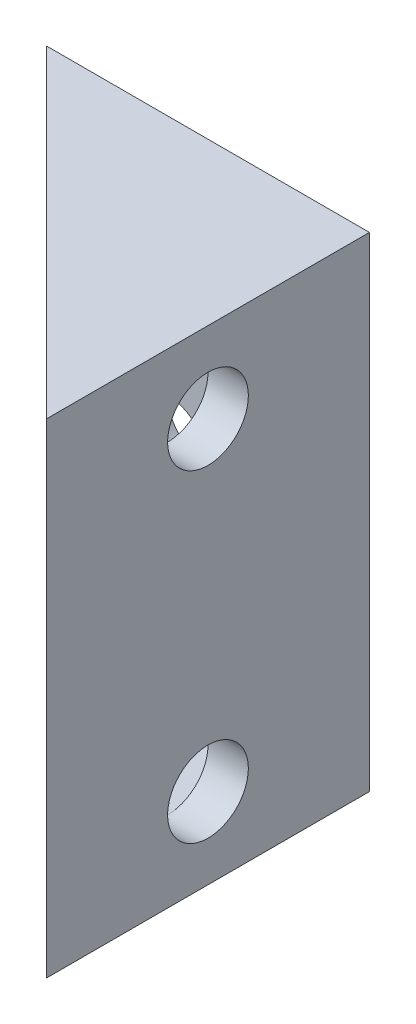
ISO-10303-21;
HEADER;
FILE_DESCRIPTION(('STEP AP214'),'2;1');
FILE_NAME('part.step','',(''),(''),'','','');
FILE_SCHEMA(('AUTOMOTIVE_DESIGN { 1 0 10303 214 1 1 1 1 }'));
ENDSEC;
DATA;
#1=APPLICATION_CONTEXT('core data for automotive mechanical design processes');
#2=APPLICATION_PROTOCOL_DEFINITION('international standard','automotive_design',2000,#1);
#3=PRODUCT_CONTEXT('',#1,'mechanical');
#4=PRODUCT('Part','Part','',(#3));
#5=PRODUCT_RELATED_PRODUCT_CATEGORY('part','',(#4));
#6=PRODUCT_DEFINITION_FORMATION('','',#4);
#7=PRODUCT_DEFINITION_CONTEXT('part definition',#1,'design');
#8=PRODUCT_DEFINITION('design','',#6,#7);
#9=PRODUCT_DEFINITION_SHAPE('','',#8);
#10=(LENGTH_UNIT() NAMED_UNIT(*) SI_UNIT(.MILLI.,.METRE.));
#11=(NAMED_UNIT(*) PLANE_ANGLE_UNIT() SI_UNIT($,.RADIAN.));
#12=(NAMED_UNIT(*) SI_UNIT($,.STERADIAN.) SOLID_ANGLE_UNIT());
#13=UNCERTAINTY_MEASURE_WITH_UNIT(LENGTH_MEASURE(1.E-05),#10,'distance_accuracy_value','');
#14=(GEOMETRIC_REPRESENTATION_CONTEXT(3) GLOBAL_UNCERTAINTY_ASSIGNED_CONTEXT((#13)) GLOBAL_UNIT_ASSIGNED_CONTEXT((#10,
#11,#12)) REPRESENTATION_CONTEXT('',''));
#15=CARTESIAN_POINT('',(0.,0.,0.));
#16=DIRECTION('',(0.,0.,1.));
#17=DIRECTION('',(1.,0.,0.));
#18=AXIS2_PLACEMENT_3D('',#15,#16,#17);
#19=CARTESIAN_POINT('',(12.7,38.1,12.7));
#20=DIRECTION('',(-1.,0.,0.));
#21=DIRECTION('',(0.,0.,1.));
#22=AXIS2_PLACEMENT_3D('',#19,#20,#21);
#23=PLANE('',#22);
#24=CARTESIAN_POINT('',(12.7,31.75,0.));
#25=DIRECTION('',(1.,0.,0.));
#26=DIRECTION('',(0.,0.,-1.));
#27=AXIS2_PLACEMENT_3D('',#24,#25,#26);
#28=CIRCLE('',#27,3.175);
#29=CARTESIAN_POINT('',(12.7,31.75,-3.175));
#30=VERTEX_POINT('',#29);
#31=EDGE_CURVE('E174',#30,#30,#28,.T.);
#32=ORIENTED_EDGE('',*,*,#31,.F.);
#33=EDGE_LOOP('',(#32));
#34=FACE_BOUND('',#33,.T.);
#35=CARTESIAN_POINT('',(12.7,6.35,0.));
#36=DIRECTION('',(1.,0.,0.));
#37=DIRECTION('',(0.,0.,-1.));
#38=AXIS2_PLACEMENT_3D('',#35,#36,#37);
#39=CIRCLE('',#38,3.175);
#40=CARTESIAN_POINT('',(12.7,6.35,-3.175));
#41=VERTEX_POINT('',#40);
#42=EDGE_CURVE('E178',#41,#41,#39,.T.);
#43=ORIENTED_EDGE('',*,*,#42,.F.);
#44=EDGE_LOOP('',(#43));
#45=FACE_BOUND('',#44,.T.);
#46=DIRECTION('',(0.,0.,-1.));
#47=VECTOR('',#46,1.);
#48=CARTESIAN_POINT('',(12.7,0.,12.7));
#49=LINE('',#48,#47);
#50=CARTESIAN_POINT('',(12.7,0.,12.7));
#51=VERTEX_POINT('',#50);
#52=CARTESIAN_POINT('',(12.7,0.,-12.7));
#53=VERTEX_POINT('',#52);
#54=EDGE_CURVE('E144',#51,#53,#49,.T.);
#55=ORIENTED_EDGE('',*,*,#54,.T.);
#56=DIRECTION('',(0.,-1.,0.));
#57=VECTOR('',#56,1.);
#58=CARTESIAN_POINT('',(12.7,38.1,-12.7));
#59=LINE('',#58,#57);
#60=CARTESIAN_POINT('',(12.7,38.1,-12.7));
#61=VERTEX_POINT('',#60);
#62=EDGE_CURVE('E12',#61,#53,#59,.T.);
#63=ORIENTED_EDGE('',*,*,#62,.F.);
#64=DIRECTION('',(0.,0.,-1.));
#65=VECTOR('',#64,1.);
#66=CARTESIAN_POINT('',(12.7,38.1,12.7));
#67=LINE('',#66,#65);
#68=CARTESIAN_POINT('',(12.7,38.1,12.7));
#69=VERTEX_POINT('',#68);
#70=EDGE_CURVE('E147',#69,#61,#67,.T.);
#71=ORIENTED_EDGE('',*,*,#70,.F.);
#72=DIRECTION('',(0.,-1.,0.));
#73=VECTOR('',#72,1.);
#74=CARTESIAN_POINT('',(12.7,38.1,12.7));
#75=LINE('',#74,#73);
#76=EDGE_CURVE('E156',#69,#51,#75,.T.);
#77=ORIENTED_EDGE('',*,*,#76,.T.);
#78=EDGE_LOOP('',(#55,#63,#71,#77));
#79=FACE_BOUND('',#78,.T.);
#80=ADVANCED_FACE('F45',(#34,#45,#79),#23,.F.);
#81=CARTESIAN_POINT('',(-12.7,38.1,-12.7));
#82=DIRECTION('',(0.,0.,1.));
#83=DIRECTION('',(1.,0.,0.));
#84=AXIS2_PLACEMENT_3D('',#81,#82,#83);
#85=PLANE('',#84);
#86=CARTESIAN_POINT('',(0.,19.05,-12.7));
#87=DIRECTION('',(0.,0.,-1.));
#88=DIRECTION('',(-1.,0.,0.));
#89=AXIS2_PLACEMENT_3D('',#86,#87,#88);
#90=CIRCLE('',#89,3.175);
#91=CARTESIAN_POINT('',(-3.175,19.05,-12.7));
#92=VERTEX_POINT('',#91);
#93=EDGE_CURVE('E172',#92,#92,#90,.T.);
#94=ORIENTED_EDGE('',*,*,#93,.F.);
#95=EDGE_LOOP('',(#94));
#96=FACE_BOUND('',#95,.T.);
#97=DIRECTION('',(-1.,0.,0.));
#98=VECTOR('',#97,1.);
#99=CARTESIAN_POINT('',(-12.7,0.,-12.7));
#100=LINE('',#99,#98);
#101=CARTESIAN_POINT('',(-12.7,0.,-12.7));
#102=VERTEX_POINT('',#101);
#103=EDGE_CURVE('E152',#53,#102,#100,.T.);
#104=ORIENTED_EDGE('',*,*,#103,.T.);
#105=DIRECTION('',(0.,-1.,0.));
#106=VECTOR('',#105,1.);
#107=CARTESIAN_POINT('',(-12.7,38.1,-12.7));
#108=LINE('',#107,#106);
#109=CARTESIAN_POINT('',(-12.7,38.1,-12.7));
#110=VERTEX_POINT('',#109);
#111=EDGE_CURVE('E54',#110,#102,#108,.T.);
#112=ORIENTED_EDGE('',*,*,#111,.F.);
#113=DIRECTION('',(-1.,0.,0.));
#114=VECTOR('',#113,1.);
#115=CARTESIAN_POINT('',(-12.7,38.1,-12.7));
#116=LINE('',#115,#114);
#117=EDGE_CURVE('E151',#61,#110,#116,.T.);
#118=ORIENTED_EDGE('',*,*,#117,.F.);
#119=ORIENTED_EDGE('',*,*,#62,.T.);
#120=EDGE_LOOP('',(#104,#112,#118,#119));
#121=FACE_BOUND('',#120,.T.);
#122=ADVANCED_FACE('F218',(#96,#121),#85,.F.);
#123=CARTESIAN_POINT('',(0.,38.1,0.));
#124=DIRECTION('',(0.,-1.,0.));
#125=DIRECTION('',(0.,0.,-1.));
#126=AXIS2_PLACEMENT_3D('',#123,#124,#125);
#127=PLANE('',#126);
#128=ORIENTED_EDGE('',*,*,#117,.T.);
#129=DIRECTION('',(-0.707106781186547,0.,-0.707106781186547));
#130=VECTOR('',#129,1.);
#131=CARTESIAN_POINT('',(-12.7,38.1,-12.7));
#132=LINE('',#131,#130);
#133=EDGE_CURVE('E138',#69,#110,#132,.T.);
#134=ORIENTED_EDGE('',*,*,#133,.F.);
#135=ORIENTED_EDGE('',*,*,#70,.T.);
#136=EDGE_LOOP('',(#128,#134,#135));
#137=FACE_BOUND('',#136,.T.);
#138=ADVANCED_FACE('F223',(#137),#127,.F.);
#139=CARTESIAN_POINT('',(0.,0.,0.));
#140=DIRECTION('',(0.,-1.,0.));
#141=DIRECTION('',(0.,0.,-1.));
#142=AXIS2_PLACEMENT_3D('',#139,#140,#141);
#143=PLANE('',#142);
#144=DIRECTION('',(-0.707106781186547,0.,-0.707106781186547));
#145=VECTOR('',#144,1.);
#146=CARTESIAN_POINT('',(-12.7,0.,-12.7));
#147=LINE('',#146,#145);
#148=EDGE_CURVE('E140',#51,#102,#147,.T.);
#149=ORIENTED_EDGE('',*,*,#148,.T.);
#150=ORIENTED_EDGE('',*,*,#103,.F.);
#151=ORIENTED_EDGE('',*,*,#54,.F.);
#152=EDGE_LOOP('',(#149,#150,#151));
#153=FACE_BOUND('',#152,.T.);
#154=ADVANCED_FACE('F232',(#153),#143,.T.);
#155=CARTESIAN_POINT('',(-12.7,0.,-12.7));
#156=DIRECTION('',(0.707106781186547,0.,-0.707106781186547));
#157=DIRECTION('',(-0.707106781186548,0.,-0.707106781186548));
#158=AXIS2_PLACEMENT_3D('',#155,#156,#157);
#159=PLANE('',#158);
#160=DIRECTION('',(0.707106781186547,0.,0.707106781186547));
#161=VECTOR('',#160,1.);
#162=CARTESIAN_POINT('',(9.525,34.925,9.525));
#163=LINE('',#162,#161);
#164=CARTESIAN_POINT('',(-9.525,34.925,-9.525));
#165=VERTEX_POINT('',#164);
#166=CARTESIAN_POINT('',(9.525,34.925,9.525));
#167=VERTEX_POINT('',#166);
#168=EDGE_CURVE('E171',#165,#167,#163,.T.);
#169=ORIENTED_EDGE('',*,*,#168,.T.);
#170=DIRECTION('',(0.,1.,0.));
#171=VECTOR('',#170,1.);
#172=CARTESIAN_POINT('',(9.525,-26.9407683632075,9.525));
#173=LINE('',#172,#171);
#174=CARTESIAN_POINT('',(9.525,3.175,9.525));
#175=VERTEX_POINT('',#174);
#176=EDGE_CURVE('E134',#175,#167,#173,.T.);
#177=ORIENTED_EDGE('',*,*,#176,.F.);
#178=DIRECTION('',(0.707106781186548,0.,0.707106781186548));
#179=VECTOR('',#178,1.);
#180=CARTESIAN_POINT('',(9.525,3.175,9.525));
#181=LINE('',#180,#179);
#182=CARTESIAN_POINT('',(-9.525,3.175,-9.525));
#183=VERTEX_POINT('',#182);
#184=EDGE_CURVE('E139',#183,#175,#181,.T.);
#185=ORIENTED_EDGE('',*,*,#184,.F.);
#186=DIRECTION('',(0.,1.,0.));
#187=VECTOR('',#186,1.);
#188=CARTESIAN_POINT('',(-9.525,-26.9407683632075,-9.525));
#189=LINE('',#188,#187);
#190=EDGE_CURVE('E122',#183,#165,#189,.T.);
#191=ORIENTED_EDGE('',*,*,#190,.T.);
#192=EDGE_LOOP('',(#169,#177,#185,#191));
#193=FACE_BOUND('',#192,.T.);
#194=ORIENTED_EDGE('',*,*,#133,.T.);
#195=ORIENTED_EDGE('',*,*,#111,.T.);
#196=ORIENTED_EDGE('',*,*,#148,.F.);
#197=ORIENTED_EDGE('',*,*,#76,.F.);
#198=EDGE_LOOP('',(#194,#195,#196,#197));
#199=FACE_BOUND('',#198,.T.);
#200=ADVANCED_FACE('F199',(#193,#199),#159,.F.);
#201=CARTESIAN_POINT('',(0.,3.175,0.));
#202=DIRECTION('',(0.,-1.,0.));
#203=DIRECTION('',(0.,0.,-1.));
#204=AXIS2_PLACEMENT_3D('',#201,#202,#203);
#205=PLANE('',#204);
#206=ORIENTED_EDGE('',*,*,#184,.T.);
#207=DIRECTION('',(0.,0.,-1.));
#208=VECTOR('',#207,1.);
#209=CARTESIAN_POINT('',(9.525,3.175,-9.525));
#210=LINE('',#209,#208);
#211=CARTESIAN_POINT('',(9.525,3.175,0.));
#212=VERTEX_POINT('',#211);
#213=EDGE_CURVE('E110',#175,#212,#210,.T.);
#214=ORIENTED_EDGE('',*,*,#213,.T.);
#215=CARTESIAN_POINT('',(9.525,3.175,-9.525));
#216=VERTEX_POINT('',#215);
#217=EDGE_CURVE('E104',#212,#216,#210,.T.);
#218=ORIENTED_EDGE('',*,*,#217,.T.);
#219=DIRECTION('',(-1.,0.,0.));
#220=VECTOR('',#219,1.);
#221=CARTESIAN_POINT('',(-9.525,3.175,-9.525));
#222=LINE('',#221,#220);
#223=EDGE_CURVE('E107',#216,#183,#222,.T.);
#224=ORIENTED_EDGE('',*,*,#223,.T.);
#225=EDGE_LOOP('',(#206,#214,#218,#224));
#226=FACE_BOUND('',#225,.T.);
#227=ADVANCED_FACE('F106',(#226),#205,.F.);
#228=CARTESIAN_POINT('',(0.,34.925,0.));
#229=DIRECTION('',(0.,-1.,0.));
#230=DIRECTION('',(0.,0.,-1.));
#231=AXIS2_PLACEMENT_3D('',#228,#229,#230);
#232=PLANE('',#231);
#233=DIRECTION('',(0.,0.,-1.));
#234=VECTOR('',#233,1.);
#235=CARTESIAN_POINT('',(9.525,34.925,-9.525));
#236=LINE('',#235,#234);
#237=CARTESIAN_POINT('',(9.525,34.925,0.));
#238=VERTEX_POINT('',#237);
#239=CARTESIAN_POINT('',(9.525,34.925,-9.525));
#240=VERTEX_POINT('',#239);
#241=EDGE_CURVE('E128',#238,#240,#236,.T.);
#242=ORIENTED_EDGE('',*,*,#241,.F.);
#243=EDGE_CURVE('E191',#167,#238,#236,.T.);
#244=ORIENTED_EDGE('',*,*,#243,.F.);
#245=ORIENTED_EDGE('',*,*,#168,.F.);
#246=DIRECTION('',(-1.,0.,0.));
#247=VECTOR('',#246,1.);
#248=CARTESIAN_POINT('',(-9.525,34.925,-9.525));
#249=LINE('',#248,#247);
#250=EDGE_CURVE('E114',#240,#165,#249,.T.);
#251=ORIENTED_EDGE('',*,*,#250,.F.);
#252=EDGE_LOOP('',(#242,#244,#245,#251));
#253=FACE_BOUND('',#252,.T.);
#254=ADVANCED_FACE('F205',(#253),#232,.T.);
#255=CARTESIAN_POINT('',(9.525,-26.9407683632075,-9.525));
#256=DIRECTION('',(1.,0.,0.));
#257=DIRECTION('',(0.,0.,-1.));
#258=AXIS2_PLACEMENT_3D('',#255,#256,#257);
#259=PLANE('',#258);
#260=ORIENTED_EDGE('',*,*,#243,.T.);
#261=CARTESIAN_POINT('',(9.525,31.75,0.));
#262=DIRECTION('',(1.,0.,0.));
#263=DIRECTION('',(0.,0.,-1.));
#264=AXIS2_PLACEMENT_3D('',#261,#262,#263);
#265=CIRCLE('',#264,3.175);
#266=EDGE_CURVE('E48',#238,#238,#265,.T.);
#267=ORIENTED_EDGE('',*,*,#266,.T.);
#268=ORIENTED_EDGE('',*,*,#241,.T.);
#269=DIRECTION('',(0.,1.,0.));
#270=VECTOR('',#269,1.);
#271=CARTESIAN_POINT('',(9.525,-26.9407683632075,-9.525));
#272=LINE('',#271,#270);
#273=EDGE_CURVE('E119',#216,#240,#272,.T.);
#274=ORIENTED_EDGE('',*,*,#273,.F.);
#275=ORIENTED_EDGE('',*,*,#217,.F.);
#276=CARTESIAN_POINT('',(9.525,6.35,0.));
#277=DIRECTION('',(1.,0.,0.));
#278=DIRECTION('',(0.,0.,-1.));
#279=AXIS2_PLACEMENT_3D('',#276,#277,#278);
#280=CIRCLE('',#279,3.175);
#281=EDGE_CURVE('E60',#212,#212,#280,.T.);
#282=ORIENTED_EDGE('',*,*,#281,.T.);
#283=ORIENTED_EDGE('',*,*,#213,.F.);
#284=ORIENTED_EDGE('',*,*,#176,.T.);
#285=EDGE_LOOP('',(#260,#267,#268,#274,#275,#282,#283,#284));
#286=FACE_BOUND('',#285,.T.);
#287=ADVANCED_FACE('F126',(#286),#259,.F.);
#288=CARTESIAN_POINT('',(-9.525,-26.9407683632075,-9.525));
#289=DIRECTION('',(0.,0.,-1.));
#290=DIRECTION('',(-1.,0.,0.));
#291=AXIS2_PLACEMENT_3D('',#288,#289,#290);
#292=PLANE('',#291);
#293=CARTESIAN_POINT('',(0.,19.05,-9.525));
#294=DIRECTION('',(0.,0.,-1.));
#295=DIRECTION('',(-1.,0.,0.));
#296=AXIS2_PLACEMENT_3D('',#293,#294,#295);
#297=CIRCLE('',#296,3.175);
#298=CARTESIAN_POINT('',(-3.175,19.05,-9.525));
#299=VERTEX_POINT('',#298);
#300=EDGE_CURVE('E168',#299,#299,#297,.T.);
#301=ORIENTED_EDGE('',*,*,#300,.T.);
#302=EDGE_LOOP('',(#301));
#303=FACE_BOUND('',#302,.T.);
#304=ORIENTED_EDGE('',*,*,#273,.T.);
#305=ORIENTED_EDGE('',*,*,#250,.T.);
#306=ORIENTED_EDGE('',*,*,#190,.F.);
#307=ORIENTED_EDGE('',*,*,#223,.F.);
#308=EDGE_LOOP('',(#304,#305,#306,#307));
#309=FACE_BOUND('',#308,.T.);
#310=ADVANCED_FACE('F118',(#303,#309),#292,.F.);
#311=CARTESIAN_POINT('',(0.,19.05,12.7));
#312=DIRECTION('',(0.,0.,-1.));
#313=DIRECTION('',(-1.,0.,0.));
#314=AXIS2_PLACEMENT_3D('',#311,#312,#313);
#315=CYLINDRICAL_SURFACE('',#314,3.175);
#316=ORIENTED_EDGE('',*,*,#93,.T.);
#317=EDGE_LOOP('',(#316));
#318=FACE_BOUND('',#317,.T.);
#319=ORIENTED_EDGE('',*,*,#300,.F.);
#320=EDGE_LOOP('',(#319));
#321=FACE_BOUND('',#320,.T.);
#322=ADVANCED_FACE('F270',(#318,#321),#315,.F.);
#323=CARTESIAN_POINT('',(-12.7,6.35,0.));
#324=DIRECTION('',(1.,0.,0.));
#325=DIRECTION('',(0.,0.,-1.));
#326=AXIS2_PLACEMENT_3D('',#323,#324,#325);
#327=CYLINDRICAL_SURFACE('',#326,3.175);
#328=ORIENTED_EDGE('',*,*,#42,.T.);
#329=EDGE_LOOP('',(#328));
#330=FACE_BOUND('',#329,.T.);
#331=ORIENTED_EDGE('',*,*,#281,.F.);
#332=EDGE_LOOP('',(#331));
#333=FACE_BOUND('',#332,.T.);
#334=ADVANCED_FACE('F280',(#330,#333),#327,.F.);
#335=CARTESIAN_POINT('',(-12.7,31.75,0.));
#336=DIRECTION('',(1.,0.,0.));
#337=DIRECTION('',(0.,0.,-1.));
#338=AXIS2_PLACEMENT_3D('',#335,#336,#337);
#339=CYLINDRICAL_SURFACE('',#338,3.175);
#340=ORIENTED_EDGE('',*,*,#31,.T.);
#341=EDGE_LOOP('',(#340));
#342=FACE_BOUND('',#341,.T.);
#343=ORIENTED_EDGE('',*,*,#266,.F.);
#344=EDGE_LOOP('',(#343));
#345=FACE_BOUND('',#344,.T.);
#346=ADVANCED_FACE('F317',(#342,#345),#339,.F.);
#347=CLOSED_SHELL('',(#80,#122,#138,#154,#200,#227,#254,#287,#310,#322,#334,#346));
#348=MANIFOLD_SOLID_BREP('B2',#347);
#349=ADVANCED_BREP_SHAPE_REPRESENTATION('',(#18,#348),#14);
#350=SHAPE_DEFINITION_REPRESENTATION(#9,#349);
ENDSEC;
END-ISO-10303-21;
